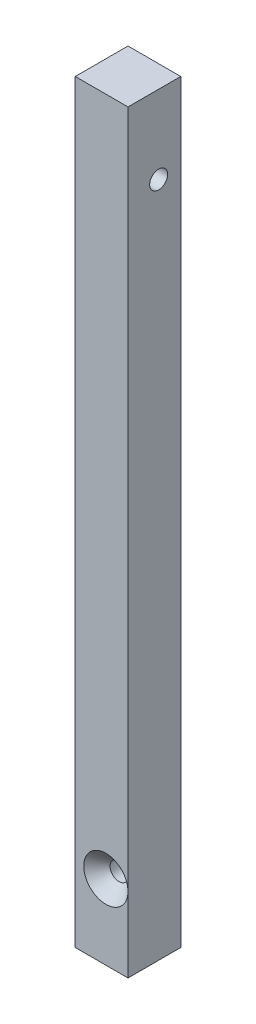
ISO-10303-21;
HEADER;
FILE_DESCRIPTION(('STEP AP214'),'2;1');
FILE_NAME('part.step','',(''),(''),'','','');
FILE_SCHEMA(('AUTOMOTIVE_DESIGN { 1 0 10303 214 1 1 1 1 }'));
ENDSEC;
DATA;
#1=APPLICATION_CONTEXT('core data for automotive mechanical design processes');
#2=APPLICATION_PROTOCOL_DEFINITION('international standard','automotive_design',2000,#1);
#3=PRODUCT_CONTEXT('',#1,'mechanical');
#4=PRODUCT('Part','Part','',(#3));
#5=PRODUCT_RELATED_PRODUCT_CATEGORY('part','',(#4));
#6=PRODUCT_DEFINITION_FORMATION('','',#4);
#7=PRODUCT_DEFINITION_CONTEXT('part definition',#1,'design');
#8=PRODUCT_DEFINITION('design','',#6,#7);
#9=PRODUCT_DEFINITION_SHAPE('','',#8);
#10=(LENGTH_UNIT() NAMED_UNIT(*) SI_UNIT(.MILLI.,.METRE.));
#11=(NAMED_UNIT(*) PLANE_ANGLE_UNIT() SI_UNIT($,.RADIAN.));
#12=(NAMED_UNIT(*) SI_UNIT($,.STERADIAN.) SOLID_ANGLE_UNIT());
#13=UNCERTAINTY_MEASURE_WITH_UNIT(LENGTH_MEASURE(1.E-05),#10,'distance_accuracy_value','');
#14=(GEOMETRIC_REPRESENTATION_CONTEXT(3) GLOBAL_UNCERTAINTY_ASSIGNED_CONTEXT((#13)) GLOBAL_UNIT_ASSIGNED_CONTEXT((#10,
#11,#12)) REPRESENTATION_CONTEXT('',''));
#15=CARTESIAN_POINT('',(0.,0.,0.));
#16=DIRECTION('',(0.,0.,1.));
#17=DIRECTION('',(1.,0.,0.));
#18=AXIS2_PLACEMENT_3D('',#15,#16,#17);
#19=CARTESIAN_POINT('',(68.5295102129493,101.737,31.3105569599933));
#20=DIRECTION('',(1.,0.,0.));
#21=DIRECTION('',(0.,0.,-1.));
#22=AXIS2_PLACEMENT_3D('',#19,#20,#21);
#23=CYLINDRICAL_SURFACE('',#22,1.35255);
#24=CARTESIAN_POINT('',(61.2543602128994,101.737,31.3105569599933));
#25=DIRECTION('',(-1.,0.,0.));
#26=DIRECTION('',(0.,-1.,0.));
#27=AXIS2_PLACEMENT_3D('',#24,#25,#26);
#28=CIRCLE('',#27,1.35254999996451);
#29=CARTESIAN_POINT('',(61.2543602128994,100.384450000035,31.3105569599933));
#30=VERTEX_POINT('',#29);
#31=EDGE_CURVE('E104',#30,#30,#28,.T.);
#32=ORIENTED_EDGE('',*,*,#31,.T.);
#33=EDGE_LOOP('',(#32));
#34=FACE_BOUND('',#33,.T.);
#35=CARTESIAN_POINT('',(67.2170102129493,101.737,31.3105569599933));
#36=DIRECTION('',(1.,0.,0.));
#37=DIRECTION('',(0.,0.,-1.));
#38=AXIS2_PLACEMENT_3D('',#35,#36,#37);
#39=CIRCLE('',#38,1.35255);
#40=CARTESIAN_POINT('',(67.2170102129493,101.737,29.9580069599933));
#41=VERTEX_POINT('',#40);
#42=EDGE_CURVE('E114',#41,#41,#39,.T.);
#43=ORIENTED_EDGE('',*,*,#42,.T.);
#44=EDGE_LOOP('',(#43));
#45=FACE_BOUND('',#44,.T.);
#46=ADVANCED_FACE('F17',(#34,#45),#23,.F.);
#47=CARTESIAN_POINT('',(63.2482602129493,56.75,35.9210569599934));
#48=DIRECTION('',(0.,0.,-1.));
#49=DIRECTION('',(-1.,0.,0.));
#50=AXIS2_PLACEMENT_3D('',#47,#48,#49);
#51=PLANE('',#50);
#52=CARTESIAN_POINT('',(63.8896102129494,11.2625,35.921056960035));
#53=DIRECTION('',(0.,0.,1.));
#54=DIRECTION('',(1.,0.,0.));
#55=AXIS2_PLACEMENT_3D('',#52,#53,#54);
#56=CIRCLE('',#55,3.32740000002181);
#57=CARTESIAN_POINT('',(67.2170102129712,11.2625,35.921056960035));
#58=VERTEX_POINT('',#57);
#59=EDGE_CURVE('E121',#58,#58,#56,.F.);
#60=ORIENTED_EDGE('',*,*,#59,.T.);
#61=EDGE_LOOP('',(#60));
#62=FACE_BOUND('',#61,.T.);
#63=DIRECTION('',(-1.,0.,0.));
#64=VECTOR('',#63,1.);
#65=CARTESIAN_POINT('',(63.2482602129493,0.,35.9210569599934));
#66=LINE('',#65,#64);
#67=CARTESIAN_POINT('',(59.2795102129493,0.,35.9210569599934));
#68=VERTEX_POINT('',#67);
#69=CARTESIAN_POINT('',(67.2170102129493,0.,35.9210569599934));
#70=VERTEX_POINT('',#69);
#71=EDGE_CURVE('E79',#68,#70,#66,.F.);
#72=ORIENTED_EDGE('',*,*,#71,.T.);
#73=DIRECTION('',(0.,1.,0.));
#74=VECTOR('',#73,1.);
#75=CARTESIAN_POINT('',(67.2170102129493,56.75,35.9210569599934));
#76=LINE('',#75,#74);
#77=CARTESIAN_POINT('',(67.2170102129493,113.5,35.9210569599934));
#78=VERTEX_POINT('',#77);
#79=EDGE_CURVE('E117',#70,#78,#76,.T.);
#80=ORIENTED_EDGE('',*,*,#79,.T.);
#81=DIRECTION('',(1.,0.,0.));
#82=VECTOR('',#81,1.);
#83=CARTESIAN_POINT('',(63.2482602129493,113.5,35.9210569599934));
#84=LINE('',#83,#82);
#85=CARTESIAN_POINT('',(59.2795102129493,113.5,35.9210569599934));
#86=VERTEX_POINT('',#85);
#87=EDGE_CURVE('E111',#86,#78,#84,.T.);
#88=ORIENTED_EDGE('',*,*,#87,.F.);
#89=DIRECTION('',(0.,1.,0.));
#90=VECTOR('',#89,1.);
#91=CARTESIAN_POINT('',(59.2795102129493,56.75,35.9210569599934));
#92=LINE('',#91,#90);
#93=EDGE_CURVE('E83',#86,#68,#92,.F.);
#94=ORIENTED_EDGE('',*,*,#93,.T.);
#95=EDGE_LOOP('',(#72,#80,#88,#94));
#96=FACE_BOUND('',#95,.T.);
#97=ADVANCED_FACE('F125',(#62,#96),#51,.F.);
#98=CARTESIAN_POINT('',(59.2795102129458,101.737,31.3105569599933));
#99=DIRECTION('',(-1.,0.,0.));
#100=DIRECTION('',(0.,0.,1.));
#101=AXIS2_PLACEMENT_3D('',#98,#99,#100);
#102=CONICAL_SURFACE('',#101,3.32739999991818,0.785398163383056);
#103=CARTESIAN_POINT('',(59.2795102128889,101.737,31.3105569599933));
#104=DIRECTION('',(-1.,0.,0.));
#105=DIRECTION('',(0.,0.,1.));
#106=AXIS2_PLACEMENT_3D('',#103,#104,#105);
#107=CIRCLE('',#106,3.32739999997503);
#108=CARTESIAN_POINT('',(59.2795102128765,101.685407753324,27.9835569599934));
#109=VERTEX_POINT('',#108);
#110=CARTESIAN_POINT('',(59.2795102128765,101.788592246676,27.9835569599934));
#111=VERTEX_POINT('',#110);
#112=EDGE_CURVE('E82',#109,#111,#107,.T.);
#113=ORIENTED_EDGE('',*,*,#112,.T.);
#114=CARTESIAN_POINT('',(59.2795102128695,101.685407752523,27.9835569599803));
#115=CARTESIAN_POINT('',(59.2797768795334,101.702605168349,27.9835569599868));
#116=CARTESIAN_POINT('',(59.279910212865,101.719802584174,27.9835569599912));
#117=CARTESIAN_POINT('',(59.2799102128632,101.754197415826,27.9835569599956));
#118=CARTESIAN_POINT('',(59.2797768795298,101.771394831651,27.9835569599956));
#119=CARTESIAN_POINT('',(59.2795102128641,101.788592247477,27.9835569599934));
#120=B_SPLINE_CURVE_WITH_KNOTS('',3,(#114,#115,#116,#117,#118,#119),.UNSPECIFIED.,.F.,.F.,(4,2,
4),(0.,0.0515937980742644,0.103187596148557),.UNSPECIFIED.);
#121=EDGE_CURVE('E20',#109,#111,#120,.T.);
#122=ORIENTED_EDGE('',*,*,#121,.F.);
#123=EDGE_LOOP('',(#113,#122));
#124=FACE_BOUND('',#123,.T.);
#125=ORIENTED_EDGE('',*,*,#31,.F.);
#126=EDGE_LOOP('',(#125));
#127=FACE_BOUND('',#126,.T.);
#128=ADVANCED_FACE('F130',(#124,#127),#102,.F.);
#129=CARTESIAN_POINT('',(63.8896102129494,11.2625,35.9210569599213));
#130=DIRECTION('',(0.,0.,1.));
#131=DIRECTION('',(1.,0.,0.));
#132=AXIS2_PLACEMENT_3D('',#129,#130,#131);
#133=CONICAL_SURFACE('',#132,3.32739999990812,0.785398163397448);
#134=CARTESIAN_POINT('',(63.8896102129494,11.2625,33.9462069599934));
#135=DIRECTION('',(0.,0.,-1.));
#136=DIRECTION('',(-1.,0.,0.));
#137=AXIS2_PLACEMENT_3D('',#134,#135,#136);
#138=CIRCLE('',#137,1.35255);
#139=CARTESIAN_POINT('',(62.5370602129494,11.2625,33.9462069599934));
#140=VERTEX_POINT('',#139);
#141=EDGE_CURVE('E93',#140,#140,#138,.T.);
#142=ORIENTED_EDGE('',*,*,#141,.T.);
#143=EDGE_LOOP('',(#142));
#144=FACE_BOUND('',#143,.T.);
#145=ORIENTED_EDGE('',*,*,#59,.F.);
#146=EDGE_LOOP('',(#145));
#147=FACE_BOUND('',#146,.T.);
#148=ADVANCED_FACE('F128',(#144,#147),#133,.F.);
#149=CARTESIAN_POINT('',(63.2482602129493,0.,31.9523069599934));
#150=DIRECTION('',(0.,1.,0.));
#151=DIRECTION('',(0.,0.,1.));
#152=AXIS2_PLACEMENT_3D('',#149,#150,#151);
#153=PLANE('',#152);
#154=DIRECTION('',(0.,0.,1.));
#155=VECTOR('',#154,1.);
#156=CARTESIAN_POINT('',(67.2170102129493,0.,31.9523069599934));
#157=LINE('',#156,#155);
#158=CARTESIAN_POINT('',(67.2170102129493,0.,27.9835569599934));
#159=VERTEX_POINT('',#158);
#160=EDGE_CURVE('E120',#159,#70,#157,.T.);
#161=ORIENTED_EDGE('',*,*,#160,.T.);
#162=ORIENTED_EDGE('',*,*,#71,.F.);
#163=DIRECTION('',(0.,0.,-1.));
#164=VECTOR('',#163,1.);
#165=CARTESIAN_POINT('',(59.2795102129493,0.,31.9523069599934));
#166=LINE('',#165,#164);
#167=CARTESIAN_POINT('',(59.2795102129493,0.,27.9835569599934));
#168=VERTEX_POINT('',#167);
#169=EDGE_CURVE('E73',#68,#168,#166,.T.);
#170=ORIENTED_EDGE('',*,*,#169,.T.);
#171=DIRECTION('',(1.,0.,0.));
#172=VECTOR('',#171,1.);
#173=CARTESIAN_POINT('',(63.2482602129493,0.,27.9835569599934));
#174=LINE('',#173,#172);
#175=EDGE_CURVE('E77',#168,#159,#174,.T.);
#176=ORIENTED_EDGE('',*,*,#175,.T.);
#177=EDGE_LOOP('',(#161,#162,#170,#176));
#178=FACE_BOUND('',#177,.T.);
#179=ADVANCED_FACE('F76',(#178),#153,.F.);
#180=CARTESIAN_POINT('',(67.2170102129493,56.75,31.9523069599934));
#181=DIRECTION('',(-1.,0.,0.));
#182=DIRECTION('',(0.,0.,1.));
#183=AXIS2_PLACEMENT_3D('',#180,#181,#182);
#184=PLANE('',#183);
#185=ORIENTED_EDGE('',*,*,#42,.F.);
#186=EDGE_LOOP('',(#185));
#187=FACE_BOUND('',#186,.T.);
#188=ORIENTED_EDGE('',*,*,#79,.F.);
#189=ORIENTED_EDGE('',*,*,#160,.F.);
#190=DIRECTION('',(0.,1.,0.));
#191=VECTOR('',#190,1.);
#192=CARTESIAN_POINT('',(67.2170102129493,56.75,27.9835569599934));
#193=LINE('',#192,#191);
#194=CARTESIAN_POINT('',(67.2170102129493,113.5,27.9835569599934));
#195=VERTEX_POINT('',#194);
#196=EDGE_CURVE('E90',#159,#195,#193,.T.);
#197=ORIENTED_EDGE('',*,*,#196,.T.);
#198=DIRECTION('',(0.,0.,1.));
#199=VECTOR('',#198,1.);
#200=CARTESIAN_POINT('',(67.2170102129493,113.5,31.9523069599934));
#201=LINE('',#200,#199);
#202=EDGE_CURVE('E113',#78,#195,#201,.F.);
#203=ORIENTED_EDGE('',*,*,#202,.F.);
#204=EDGE_LOOP('',(#188,#189,#197,#203));
#205=FACE_BOUND('',#204,.T.);
#206=ADVANCED_FACE('F138',(#187,#205),#184,.F.);
#207=CARTESIAN_POINT('',(63.2482602129493,113.5,31.9523069599934));
#208=DIRECTION('',(0.,1.,0.));
#209=DIRECTION('',(0.,0.,1.));
#210=AXIS2_PLACEMENT_3D('',#207,#208,#209);
#211=PLANE('',#210);
#212=ORIENTED_EDGE('',*,*,#87,.T.);
#213=ORIENTED_EDGE('',*,*,#202,.T.);
#214=DIRECTION('',(1.,0.,0.));
#215=VECTOR('',#214,1.);
#216=CARTESIAN_POINT('',(63.2482602129493,113.5,27.9835569599934));
#217=LINE('',#216,#215);
#218=CARTESIAN_POINT('',(59.2795102129493,113.5,27.9835569599934));
#219=VERTEX_POINT('',#218);
#220=EDGE_CURVE('E171',#195,#219,#217,.F.);
#221=ORIENTED_EDGE('',*,*,#220,.T.);
#222=DIRECTION('',(0.,0.,-1.));
#223=VECTOR('',#222,1.);
#224=CARTESIAN_POINT('',(59.2795102129493,113.5,31.9523069599934));
#225=LINE('',#224,#223);
#226=EDGE_CURVE('E46',#219,#86,#225,.F.);
#227=ORIENTED_EDGE('',*,*,#226,.T.);
#228=EDGE_LOOP('',(#212,#213,#221,#227));
#229=FACE_BOUND('',#228,.T.);
#230=ADVANCED_FACE('F153',(#229),#211,.T.);
#231=CARTESIAN_POINT('',(59.2795102129493,56.75,31.9523069599934));
#232=DIRECTION('',(1.,0.,0.));
#233=DIRECTION('',(0.,0.,-1.));
#234=AXIS2_PLACEMENT_3D('',#231,#232,#233);
#235=PLANE('',#234);
#236=DIRECTION('',(0.,1.,0.));
#237=VECTOR('',#236,1.);
#238=CARTESIAN_POINT('',(59.2795102129493,56.75,27.9835569599934));
#239=LINE('',#238,#237);
#240=EDGE_CURVE('E87',#109,#168,#239,.F.);
#241=ORIENTED_EDGE('',*,*,#240,.T.);
#242=ORIENTED_EDGE('',*,*,#169,.F.);
#243=ORIENTED_EDGE('',*,*,#93,.F.);
#244=ORIENTED_EDGE('',*,*,#226,.F.);
#245=DIRECTION('',(0.,1.,0.));
#246=VECTOR('',#245,1.);
#247=CARTESIAN_POINT('',(59.2795102129493,56.75,27.9835569599934));
#248=LINE('',#247,#246);
#249=EDGE_CURVE('E30',#219,#111,#248,.F.);
#250=ORIENTED_EDGE('',*,*,#249,.T.);
#251=ORIENTED_EDGE('',*,*,#112,.F.);
#252=EDGE_LOOP('',(#241,#242,#243,#244,#250,#251));
#253=FACE_BOUND('',#252,.T.);
#254=ADVANCED_FACE('F92',(#253),#235,.F.);
#255=CARTESIAN_POINT('',(63.8896102129494,11.2625,26.6710569599934));
#256=DIRECTION('',(0.,0.,-1.));
#257=DIRECTION('',(-1.,0.,0.));
#258=AXIS2_PLACEMENT_3D('',#255,#256,#257);
#259=CYLINDRICAL_SURFACE('',#258,1.35255);
#260=ORIENTED_EDGE('',*,*,#141,.F.);
#261=EDGE_LOOP('',(#260));
#262=FACE_BOUND('',#261,.T.);
#263=CARTESIAN_POINT('',(63.8896102129494,11.2625,27.9835569599934));
#264=DIRECTION('',(0.,0.,-1.));
#265=DIRECTION('',(-1.,0.,0.));
#266=AXIS2_PLACEMENT_3D('',#263,#264,#265);
#267=CIRCLE('',#266,1.35255);
#268=CARTESIAN_POINT('',(62.5370602129494,11.2625,27.9835569599934));
#269=VERTEX_POINT('',#268);
#270=EDGE_CURVE('E11',#269,#269,#267,.T.);
#271=ORIENTED_EDGE('',*,*,#270,.T.);
#272=EDGE_LOOP('',(#271));
#273=FACE_BOUND('',#272,.T.);
#274=ADVANCED_FACE('F141',(#262,#273),#259,.F.);
#275=CARTESIAN_POINT('',(63.2482602129493,56.75,27.9835569599934));
#276=DIRECTION('',(0.,0.,1.));
#277=DIRECTION('',(1.,0.,0.));
#278=AXIS2_PLACEMENT_3D('',#275,#276,#277);
#279=PLANE('',#278);
#280=ORIENTED_EDGE('',*,*,#270,.F.);
#281=EDGE_LOOP('',(#280));
#282=FACE_BOUND('',#281,.T.);
#283=ORIENTED_EDGE('',*,*,#249,.F.);
#284=ORIENTED_EDGE('',*,*,#220,.F.);
#285=ORIENTED_EDGE('',*,*,#196,.F.);
#286=ORIENTED_EDGE('',*,*,#175,.F.);
#287=ORIENTED_EDGE('',*,*,#240,.F.);
#288=ORIENTED_EDGE('',*,*,#121,.T.);
#289=EDGE_LOOP('',(#283,#284,#285,#286,#287,#288));
#290=FACE_BOUND('',#289,.T.);
#291=ADVANCED_FACE('F86',(#282,#290),#279,.F.);
#292=CLOSED_SHELL('',(#46,#97,#128,#148,#179,#206,#230,#254,#274,#291));
#293=MANIFOLD_SOLID_BREP('B1',#292);
#294=ADVANCED_BREP_SHAPE_REPRESENTATION('',(#18,#293),#14);
#295=SHAPE_DEFINITION_REPRESENTATION(#9,#294);
ENDSEC;
END-ISO-10303-21;
